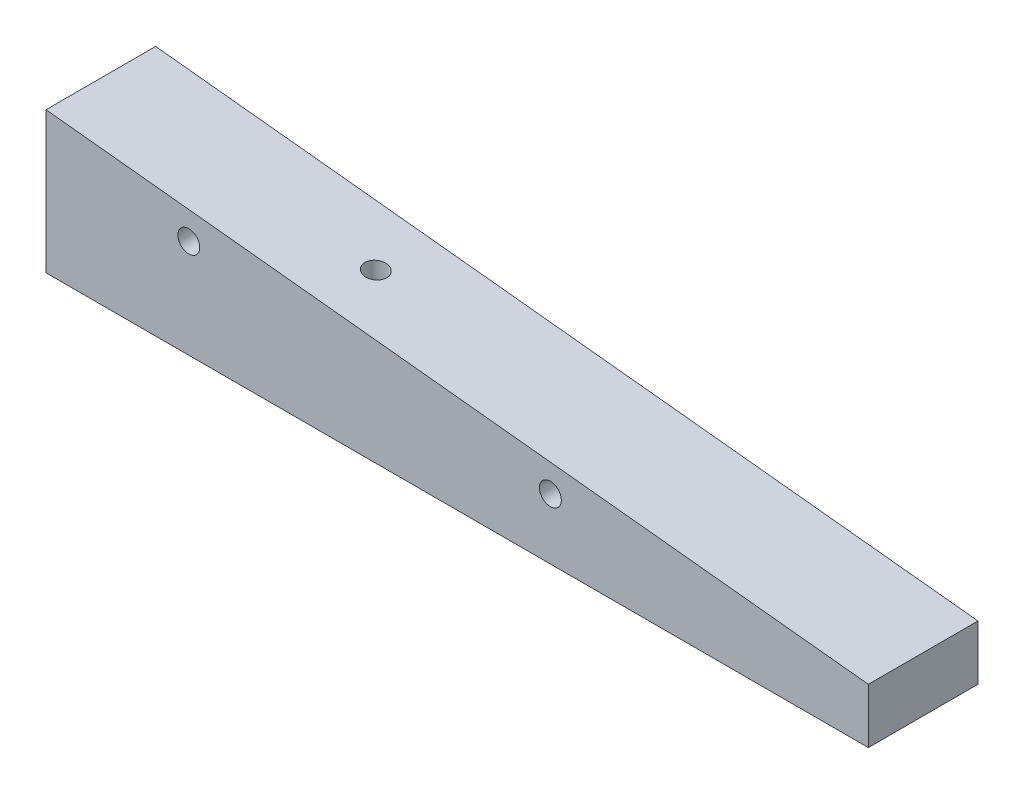
ISO-10303-21;
HEADER;
FILE_DESCRIPTION(('STEP AP214'),'2;1');
FILE_NAME('part.step','',(''),(''),'','','');
FILE_SCHEMA(('AUTOMOTIVE_DESIGN { 1 0 10303 214 1 1 1 1 }'));
ENDSEC;
DATA;
#1=APPLICATION_CONTEXT('core data for automotive mechanical design processes');
#2=APPLICATION_PROTOCOL_DEFINITION('international standard','automotive_design',2000,#1);
#3=PRODUCT_CONTEXT('',#1,'mechanical');
#4=PRODUCT('Part','Part','',(#3));
#5=PRODUCT_RELATED_PRODUCT_CATEGORY('part','',(#4));
#6=PRODUCT_DEFINITION_FORMATION('','',#4);
#7=PRODUCT_DEFINITION_CONTEXT('part definition',#1,'design');
#8=PRODUCT_DEFINITION('design','',#6,#7);
#9=PRODUCT_DEFINITION_SHAPE('','',#8);
#10=(LENGTH_UNIT() NAMED_UNIT(*) SI_UNIT(.MILLI.,.METRE.));
#11=(NAMED_UNIT(*) PLANE_ANGLE_UNIT() SI_UNIT($,.RADIAN.));
#12=(NAMED_UNIT(*) SI_UNIT($,.STERADIAN.) SOLID_ANGLE_UNIT());
#13=UNCERTAINTY_MEASURE_WITH_UNIT(LENGTH_MEASURE(1.E-05),#10,'distance_accuracy_value','');
#14=(GEOMETRIC_REPRESENTATION_CONTEXT(3) GLOBAL_UNCERTAINTY_ASSIGNED_CONTEXT((#13)) GLOBAL_UNIT_ASSIGNED_CONTEXT((#10,
#11,#12)) REPRESENTATION_CONTEXT('',''));
#15=CARTESIAN_POINT('',(0.,0.,0.));
#16=DIRECTION('',(0.,0.,1.));
#17=DIRECTION('',(1.,0.,0.));
#18=AXIS2_PLACEMENT_3D('',#15,#16,#17);
#19=CARTESIAN_POINT('',(99.8523191631007,10.,10.));
#20=DIRECTION('',(-1.,0.,0.));
#21=DIRECTION('',(0.,0.,1.));
#22=AXIS2_PLACEMENT_3D('',#19,#20,#21);
#23=PLANE('',#22);
#24=DIRECTION('',(0.,1.,0.));
#25=VECTOR('',#24,1.);
#26=CARTESIAN_POINT('',(99.8523191631007,10.,-10.));
#27=LINE('',#26,#25);
#28=CARTESIAN_POINT('',(99.8523191631007,0.,-10.));
#29=VERTEX_POINT('',#28);
#30=CARTESIAN_POINT('',(99.8523191631007,10.,-10.));
#31=VERTEX_POINT('',#30);
#32=EDGE_CURVE('E113',#29,#31,#27,.T.);
#33=ORIENTED_EDGE('',*,*,#32,.T.);
#34=DIRECTION('',(0.,0.,-1.));
#35=VECTOR('',#34,1.);
#36=CARTESIAN_POINT('',(99.8523191631007,10.,10.));
#37=LINE('',#36,#35);
#38=CARTESIAN_POINT('',(99.8523191631007,10.,10.));
#39=VERTEX_POINT('',#38);
#40=EDGE_CURVE('E11',#39,#31,#37,.T.);
#41=ORIENTED_EDGE('',*,*,#40,.F.);
#42=DIRECTION('',(0.,1.,0.));
#43=VECTOR('',#42,1.);
#44=CARTESIAN_POINT('',(99.8523191631007,10.,10.));
#45=LINE('',#44,#43);
#46=CARTESIAN_POINT('',(99.8523191631007,0.,10.));
#47=VERTEX_POINT('',#46);
#48=EDGE_CURVE('E96',#47,#39,#45,.T.);
#49=ORIENTED_EDGE('',*,*,#48,.F.);
#50=DIRECTION('',(0.,0.,-1.));
#51=VECTOR('',#50,1.);
#52=CARTESIAN_POINT('',(99.8523191631007,0.,10.));
#53=LINE('',#52,#51);
#54=EDGE_CURVE('E109',#47,#29,#53,.T.);
#55=ORIENTED_EDGE('',*,*,#54,.T.);
#56=EDGE_LOOP('',(#33,#41,#49,#55));
#57=FACE_BOUND('',#56,.T.);
#58=ADVANCED_FACE('F43',(#57),#23,.F.);
#59=CARTESIAN_POINT('',(99.8523191631007,10.,10.));
#60=DIRECTION('',(-0.104528463267646,-0.994521895368274,0.));
#61=DIRECTION('',(0.994521895368274,-0.104528463267646,0.));
#62=AXIS2_PLACEMENT_3D('',#59,#60,#61);
#63=PLANE('',#62);
#64=CARTESIAN_POINT('',(0.,20.4949016451412,0.));
#65=DIRECTION('',(-0.104528463267646,-0.994521895368274,0.));
#66=DIRECTION('',(0.994521895368274,-0.104528463267646,0.));
#67=AXIS2_PLACEMENT_3D('',#64,#65,#66);
#68=ELLIPSE('',#67,2.01101655912703,2.);
#69=CARTESIAN_POINT('',(2.,20.2846931746099,0.));
#70=VERTEX_POINT('',#69);
#71=EDGE_CURVE('E117',#70,#70,#68,.T.);
#72=ORIENTED_EDGE('',*,*,#71,.T.);
#73=EDGE_LOOP('',(#72));
#74=FACE_BOUND('',#73,.T.);
#75=DIRECTION('',(-0.994521895368274,0.104528463267646,0.));
#76=VECTOR('',#75,1.);
#77=CARTESIAN_POINT('',(99.8523191631007,10.,-10.));
#78=LINE('',#77,#76);
#79=CARTESIAN_POINT('',(-50.1476808368993,25.7656352898504,-10.));
#80=VERTEX_POINT('',#79);
#81=EDGE_CURVE('E101',#31,#80,#78,.T.);
#82=ORIENTED_EDGE('',*,*,#81,.T.);
#83=DIRECTION('',(0.,0.,-1.));
#84=VECTOR('',#83,1.);
#85=CARTESIAN_POINT('',(-50.1476808368993,25.7656352898504,10.));
#86=LINE('',#85,#84);
#87=CARTESIAN_POINT('',(-50.1476808368993,25.7656352898504,10.));
#88=VERTEX_POINT('',#87);
#89=EDGE_CURVE('E53',#88,#80,#86,.T.);
#90=ORIENTED_EDGE('',*,*,#89,.F.);
#91=DIRECTION('',(-0.994521895368274,0.104528463267646,0.));
#92=VECTOR('',#91,1.);
#93=CARTESIAN_POINT('',(99.8523191631007,10.,10.));
#94=LINE('',#93,#92);
#95=EDGE_CURVE('E91',#39,#88,#94,.T.);
#96=ORIENTED_EDGE('',*,*,#95,.F.);
#97=ORIENTED_EDGE('',*,*,#40,.T.);
#98=EDGE_LOOP('',(#82,#90,#96,#97));
#99=FACE_BOUND('',#98,.T.);
#100=ADVANCED_FACE('F100',(#74,#99),#63,.F.);
#101=CARTESIAN_POINT('',(-50.1476808368993,0.,10.));
#102=DIRECTION('',(1.,0.,0.));
#103=DIRECTION('',(0.,0.,-1.));
#104=AXIS2_PLACEMENT_3D('',#101,#102,#103);
#105=PLANE('',#104);
#106=DIRECTION('',(0.,-1.,0.));
#107=VECTOR('',#106,1.);
#108=CARTESIAN_POINT('',(-50.1476808368993,0.,-10.));
#109=LINE('',#108,#107);
#110=CARTESIAN_POINT('',(-50.1476808368993,0.,-10.));
#111=VERTEX_POINT('',#110);
#112=EDGE_CURVE('E78',#80,#111,#109,.T.);
#113=ORIENTED_EDGE('',*,*,#112,.T.);
#114=DIRECTION('',(0.,0.,-1.));
#115=VECTOR('',#114,1.);
#116=CARTESIAN_POINT('',(-50.1476808368993,0.,10.));
#117=LINE('',#116,#115);
#118=CARTESIAN_POINT('',(-50.1476808368993,0.,10.));
#119=VERTEX_POINT('',#118);
#120=EDGE_CURVE('E103',#119,#111,#117,.T.);
#121=ORIENTED_EDGE('',*,*,#120,.F.);
#122=DIRECTION('',(0.,-1.,0.));
#123=VECTOR('',#122,1.);
#124=CARTESIAN_POINT('',(-50.1476808368993,0.,10.));
#125=LINE('',#124,#123);
#126=EDGE_CURVE('E94',#88,#119,#125,.T.);
#127=ORIENTED_EDGE('',*,*,#126,.F.);
#128=ORIENTED_EDGE('',*,*,#89,.T.);
#129=EDGE_LOOP('',(#113,#121,#127,#128));
#130=FACE_BOUND('',#129,.T.);
#131=ADVANCED_FACE('F105',(#130),#105,.F.);
#132=CARTESIAN_POINT('',(99.8523191631007,0.,10.));
#133=DIRECTION('',(0.,1.,0.));
#134=DIRECTION('',(0.,0.,1.));
#135=AXIS2_PLACEMENT_3D('',#132,#133,#134);
#136=PLANE('',#135);
#137=CARTESIAN_POINT('',(0.,0.,0.));
#138=DIRECTION('',(0.,1.,0.));
#139=DIRECTION('',(0.,0.,1.));
#140=AXIS2_PLACEMENT_3D('',#137,#138,#139);
#141=CIRCLE('',#140,2.);
#142=CARTESIAN_POINT('',(0.,0.,2.));
#143=VERTEX_POINT('',#142);
#144=EDGE_CURVE('E46',#143,#143,#141,.T.);
#145=ORIENTED_EDGE('',*,*,#144,.T.);
#146=EDGE_LOOP('',(#145));
#147=FACE_BOUND('',#146,.T.);
#148=DIRECTION('',(1.,0.,0.));
#149=VECTOR('',#148,1.);
#150=CARTESIAN_POINT('',(99.8523191631007,0.,-10.));
#151=LINE('',#150,#149);
#152=EDGE_CURVE('E84',#111,#29,#151,.T.);
#153=ORIENTED_EDGE('',*,*,#152,.T.);
#154=ORIENTED_EDGE('',*,*,#54,.F.);
#155=DIRECTION('',(1.,0.,0.));
#156=VECTOR('',#155,1.);
#157=CARTESIAN_POINT('',(99.8523191631007,0.,10.));
#158=LINE('',#157,#156);
#159=EDGE_CURVE('E61',#119,#47,#158,.T.);
#160=ORIENTED_EDGE('',*,*,#159,.F.);
#161=ORIENTED_EDGE('',*,*,#120,.T.);
#162=EDGE_LOOP('',(#153,#154,#160,#161));
#163=FACE_BOUND('',#162,.T.);
#164=ADVANCED_FACE('F127',(#147,#163),#136,.F.);
#165=CARTESIAN_POINT('',(0.,0.,10.));
#166=DIRECTION('',(0.,0.,-1.));
#167=DIRECTION('',(-1.,0.,0.));
#168=AXIS2_PLACEMENT_3D('',#165,#166,#167);
#169=PLANE('',#168);
#170=CARTESIAN_POINT('',(-24.1039328744866,18.0007856789916,10.));
#171=DIRECTION('',(0.,0.,-1.));
#172=DIRECTION('',(-1.,0.,0.));
#173=AXIS2_PLACEMENT_3D('',#170,#171,#172);
#174=CIRCLE('',#173,2.);
#175=CARTESIAN_POINT('',(-26.1039328744866,18.0007856789916,10.));
#176=VERTEX_POINT('',#175);
#177=EDGE_CURVE('E149',#176,#176,#174,.T.);
#178=ORIENTED_EDGE('',*,*,#177,.T.);
#179=EDGE_LOOP('',(#178));
#180=FACE_BOUND('',#179,.T.);
#181=CARTESIAN_POINT('',(41.8489822001359,11.0688549765318,10.));
#182=DIRECTION('',(0.,0.,-1.));
#183=DIRECTION('',(-1.,0.,0.));
#184=AXIS2_PLACEMENT_3D('',#181,#182,#183);
#185=CIRCLE('',#184,2.);
#186=CARTESIAN_POINT('',(39.8489822001359,11.0688549765318,10.));
#187=VERTEX_POINT('',#186);
#188=EDGE_CURVE('E137',#187,#187,#185,.T.);
#189=ORIENTED_EDGE('',*,*,#188,.T.);
#190=EDGE_LOOP('',(#189));
#191=FACE_BOUND('',#190,.T.);
#192=ORIENTED_EDGE('',*,*,#48,.T.);
#193=ORIENTED_EDGE('',*,*,#95,.T.);
#194=ORIENTED_EDGE('',*,*,#126,.T.);
#195=ORIENTED_EDGE('',*,*,#159,.T.);
#196=EDGE_LOOP('',(#192,#193,#194,#195));
#197=FACE_BOUND('',#196,.T.);
#198=ADVANCED_FACE('F92',(#180,#191,#197),#169,.F.);
#199=CARTESIAN_POINT('',(0.,0.,-10.));
#200=DIRECTION('',(0.,0.,-1.));
#201=DIRECTION('',(-1.,0.,0.));
#202=AXIS2_PLACEMENT_3D('',#199,#200,#201);
#203=PLANE('',#202);
#204=CARTESIAN_POINT('',(-24.1039328744866,18.0007856789916,-10.));
#205=DIRECTION('',(0.,0.,-1.));
#206=DIRECTION('',(-1.,0.,0.));
#207=AXIS2_PLACEMENT_3D('',#204,#205,#206);
#208=CIRCLE('',#207,2.);
#209=CARTESIAN_POINT('',(-26.1039328744866,18.0007856789916,-10.));
#210=VERTEX_POINT('',#209);
#211=EDGE_CURVE('E145',#210,#210,#208,.T.);
#212=ORIENTED_EDGE('',*,*,#211,.F.);
#213=EDGE_LOOP('',(#212));
#214=FACE_BOUND('',#213,.T.);
#215=CARTESIAN_POINT('',(41.8489822001359,11.0688549765318,-10.));
#216=DIRECTION('',(0.,0.,-1.));
#217=DIRECTION('',(-1.,0.,0.));
#218=AXIS2_PLACEMENT_3D('',#215,#216,#217);
#219=CIRCLE('',#218,2.);
#220=CARTESIAN_POINT('',(39.8489822001359,11.0688549765318,-10.));
#221=VERTEX_POINT('',#220);
#222=EDGE_CURVE('E141',#221,#221,#219,.T.);
#223=ORIENTED_EDGE('',*,*,#222,.F.);
#224=EDGE_LOOP('',(#223));
#225=FACE_BOUND('',#224,.T.);
#226=ORIENTED_EDGE('',*,*,#32,.F.);
#227=ORIENTED_EDGE('',*,*,#152,.F.);
#228=ORIENTED_EDGE('',*,*,#112,.F.);
#229=ORIENTED_EDGE('',*,*,#81,.F.);
#230=EDGE_LOOP('',(#226,#227,#228,#229));
#231=FACE_BOUND('',#230,.T.);
#232=ADVANCED_FACE('F130',(#214,#225,#231),#203,.T.);
#233=CARTESIAN_POINT('',(0.,25.7656352898504,0.));
#234=DIRECTION('',(0.,-1.,0.));
#235=DIRECTION('',(0.,0.,-1.));
#236=AXIS2_PLACEMENT_3D('',#233,#234,#235);
#237=CYLINDRICAL_SURFACE('',#236,2.);
#238=ORIENTED_EDGE('',*,*,#144,.F.);
#239=EDGE_LOOP('',(#238));
#240=FACE_BOUND('',#239,.T.);
#241=ORIENTED_EDGE('',*,*,#71,.F.);
#242=EDGE_LOOP('',(#241));
#243=FACE_BOUND('',#242,.T.);
#244=ADVANCED_FACE('F159',(#240,#243),#237,.F.);
#245=CARTESIAN_POINT('',(41.8489822001359,11.0688549765318,10.));
#246=DIRECTION('',(0.,0.,-1.));
#247=DIRECTION('',(-1.,0.,0.));
#248=AXIS2_PLACEMENT_3D('',#245,#246,#247);
#249=CYLINDRICAL_SURFACE('',#248,2.);
#250=ORIENTED_EDGE('',*,*,#188,.F.);
#251=EDGE_LOOP('',(#250));
#252=FACE_BOUND('',#251,.T.);
#253=ORIENTED_EDGE('',*,*,#222,.T.);
#254=EDGE_LOOP('',(#253));
#255=FACE_BOUND('',#254,.T.);
#256=ADVANCED_FACE('F162',(#252,#255),#249,.F.);
#257=CARTESIAN_POINT('',(-24.1039328744866,18.0007856789916,10.));
#258=DIRECTION('',(0.,0.,-1.));
#259=DIRECTION('',(-1.,0.,0.));
#260=AXIS2_PLACEMENT_3D('',#257,#258,#259);
#261=CYLINDRICAL_SURFACE('',#260,2.);
#262=ORIENTED_EDGE('',*,*,#177,.F.);
#263=EDGE_LOOP('',(#262));
#264=FACE_BOUND('',#263,.T.);
#265=ORIENTED_EDGE('',*,*,#211,.T.);
#266=EDGE_LOOP('',(#265));
#267=FACE_BOUND('',#266,.T.);
#268=ADVANCED_FACE('F182',(#264,#267),#261,.F.);
#269=CLOSED_SHELL('',(#58,#100,#131,#164,#198,#232,#244,#256,#268));
#270=MANIFOLD_SOLID_BREP('B2',#269);
#271=ADVANCED_BREP_SHAPE_REPRESENTATION('',(#18,#270),#14);
#272=SHAPE_DEFINITION_REPRESENTATION(#9,#271);
ENDSEC;
END-ISO-10303-21;
